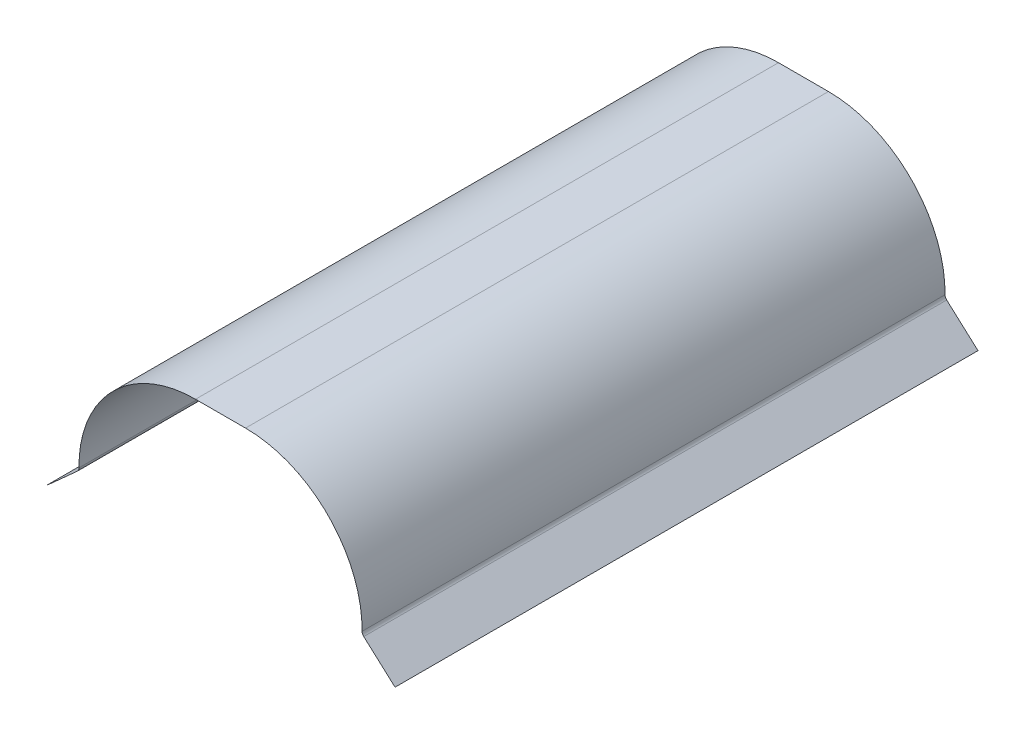
ISO-10303-21;
HEADER;
FILE_DESCRIPTION(('STEP AP214'),'2;1');
FILE_NAME('part.step','',(''),(''),'','','');
FILE_SCHEMA(('AUTOMOTIVE_DESIGN { 1 0 10303 214 1 1 1 1 }'));
ENDSEC;
DATA;
#1=APPLICATION_CONTEXT('core data for automotive mechanical design processes');
#2=APPLICATION_PROTOCOL_DEFINITION('international standard','automotive_design',2000,#1);
#3=PRODUCT_CONTEXT('',#1,'mechanical');
#4=PRODUCT('Part','Part','',(#3));
#5=PRODUCT_RELATED_PRODUCT_CATEGORY('part','',(#4));
#6=PRODUCT_DEFINITION_FORMATION('','',#4);
#7=PRODUCT_DEFINITION_CONTEXT('part definition',#1,'design');
#8=PRODUCT_DEFINITION('design','',#6,#7);
#9=PRODUCT_DEFINITION_SHAPE('','',#8);
#10=(LENGTH_UNIT() NAMED_UNIT(*) SI_UNIT(.MILLI.,.METRE.));
#11=(NAMED_UNIT(*) PLANE_ANGLE_UNIT() SI_UNIT($,.RADIAN.));
#12=(NAMED_UNIT(*) SI_UNIT($,.STERADIAN.) SOLID_ANGLE_UNIT());
#13=UNCERTAINTY_MEASURE_WITH_UNIT(LENGTH_MEASURE(1.E-05),#10,'distance_accuracy_value','');
#14=(GEOMETRIC_REPRESENTATION_CONTEXT(3) GLOBAL_UNCERTAINTY_ASSIGNED_CONTEXT((#13)) GLOBAL_UNIT_ASSIGNED_CONTEXT((#10,
#11,#12)) REPRESENTATION_CONTEXT('',''));
#15=CARTESIAN_POINT('',(0.,0.,0.));
#16=DIRECTION('',(0.,0.,1.));
#17=DIRECTION('',(1.,0.,0.));
#18=AXIS2_PLACEMENT_3D('',#15,#16,#17);
#19=CARTESIAN_POINT('',(15.,80.,350.));
#20=DIRECTION('',(0.,0.,1.));
#21=DIRECTION('',(1.,0.,0.));
#22=AXIS2_PLACEMENT_3D('',#19,#20,#21);
#23=PLANE('',#22);
#24=DIRECTION('',(0.,1.,0.));
#25=VECTOR('',#24,1.);
#26=CARTESIAN_POINT('',(15.,80.,350.));
#27=LINE('',#26,#25);
#28=CARTESIAN_POINT('',(15.,80.,350.));
#29=VERTEX_POINT('',#28);
#30=CARTESIAN_POINT('',(15.,80.001,350.));
#31=VERTEX_POINT('',#30);
#32=EDGE_CURVE('E11',#29,#31,#27,.T.);
#33=ORIENTED_EDGE('',*,*,#32,.F.);
#34=CARTESIAN_POINT('',(15.,9.99999999999998,350.));
#35=DIRECTION('',(0.,0.,1.));
#36=DIRECTION('',(1.,0.,0.));
#37=AXIS2_PLACEMENT_3D('',#34,#35,#36);
#38=CIRCLE('',#37,70.);
#39=CARTESIAN_POINT('',(84.9969029828859,9.3415375451356,350.));
#40=VERTEX_POINT('',#39);
#41=EDGE_CURVE('E303',#40,#29,#38,.T.);
#42=ORIENTED_EDGE('',*,*,#41,.F.);
#43=DIRECTION('',(0.999955756898279,-0.00940660650767222,0.));
#44=VECTOR('',#43,1.);
#45=CARTESIAN_POINT('',(84.9969029828859,9.3415375451356,350.));
#46=LINE('',#45,#44);
#47=CARTESIAN_POINT('',(84.9979029386428,9.34152813852909,350.));
#48=VERTEX_POINT('',#47);
#49=EDGE_CURVE('E289',#40,#48,#46,.T.);
#50=ORIENTED_EDGE('',*,*,#49,.T.);
#51=CARTESIAN_POINT('',(15.,9.99999999999998,350.));
#52=DIRECTION('',(0.,0.,1.));
#53=DIRECTION('',(1.,0.,0.));
#54=AXIS2_PLACEMENT_3D('',#51,#52,#53);
#55=CIRCLE('',#54,70.001);
#56=EDGE_CURVE('E179',#48,#31,#55,.T.);
#57=ORIENTED_EDGE('',*,*,#56,.T.);
#58=EDGE_LOOP('',(#33,#42,#50,#57));
#59=FACE_BOUND('',#58,.T.);
#60=ADVANCED_FACE('F37',(#59),#23,.T.);
#61=CARTESIAN_POINT('',(15.,80.001,0.));
#62=DIRECTION('',(0.,0.,-1.));
#63=DIRECTION('',(-1.,0.,0.));
#64=AXIS2_PLACEMENT_3D('',#61,#62,#63);
#65=PLANE('',#64);
#66=DIRECTION('',(0.,-1.,0.));
#67=VECTOR('',#66,1.);
#68=CARTESIAN_POINT('',(15.,80.001,0.));
#69=LINE('',#68,#67);
#70=CARTESIAN_POINT('',(15.,80.001,0.));
#71=VERTEX_POINT('',#70);
#72=CARTESIAN_POINT('',(15.,80.,0.));
#73=VERTEX_POINT('',#72);
#74=EDGE_CURVE('E45',#71,#73,#69,.T.);
#75=ORIENTED_EDGE('',*,*,#74,.F.);
#76=CARTESIAN_POINT('',(15.,9.99999999999998,0.));
#77=DIRECTION('',(0.,0.,1.));
#78=DIRECTION('',(1.,0.,0.));
#79=AXIS2_PLACEMENT_3D('',#76,#77,#78);
#80=CIRCLE('',#79,70.001);
#81=CARTESIAN_POINT('',(84.9979029386428,9.34152813852909,0.));
#82=VERTEX_POINT('',#81);
#83=EDGE_CURVE('E234',#82,#71,#80,.T.);
#84=ORIENTED_EDGE('',*,*,#83,.F.);
#85=DIRECTION('',(-0.999955756898279,0.00940660650767222,0.));
#86=VECTOR('',#85,1.);
#87=CARTESIAN_POINT('',(84.9979029386428,9.34152813852909,0.));
#88=LINE('',#87,#86);
#89=CARTESIAN_POINT('',(84.9969029828859,9.3415375451356,0.));
#90=VERTEX_POINT('',#89);
#91=EDGE_CURVE('E283',#82,#90,#88,.T.);
#92=ORIENTED_EDGE('',*,*,#91,.T.);
#93=CARTESIAN_POINT('',(15.,9.99999999999998,0.));
#94=DIRECTION('',(0.,0.,1.));
#95=DIRECTION('',(1.,0.,0.));
#96=AXIS2_PLACEMENT_3D('',#93,#94,#95);
#97=CIRCLE('',#96,70.);
#98=EDGE_CURVE('E216',#90,#73,#97,.T.);
#99=ORIENTED_EDGE('',*,*,#98,.T.);
#100=EDGE_LOOP('',(#75,#84,#92,#99));
#101=FACE_BOUND('',#100,.T.);
#102=ADVANCED_FACE('F307',(#101),#65,.T.);
#103=CARTESIAN_POINT('',(-15.,80.001,350.));
#104=DIRECTION('',(0.,0.,1.));
#105=DIRECTION('',(1.,0.,0.));
#106=AXIS2_PLACEMENT_3D('',#103,#104,#105);
#107=PLANE('',#106);
#108=DIRECTION('',(-3.46944695195014E-12,-1.,0.));
#109=VECTOR('',#108,1.);
#110=CARTESIAN_POINT('',(-15.,80.001,350.));
#111=LINE('',#110,#109);
#112=CARTESIAN_POINT('',(-15.,80.001,350.));
#113=VERTEX_POINT('',#112);
#114=CARTESIAN_POINT('',(-15.,80.,350.));
#115=VERTEX_POINT('',#114);
#116=EDGE_CURVE('E158',#113,#115,#111,.T.);
#117=ORIENTED_EDGE('',*,*,#116,.F.);
#118=CARTESIAN_POINT('',(-15.,9.99999999999998,350.));
#119=DIRECTION('',(0.,0.,1.));
#120=DIRECTION('',(1.,0.,0.));
#121=AXIS2_PLACEMENT_3D('',#118,#119,#120);
#122=CIRCLE('',#121,70.001);
#123=CARTESIAN_POINT('',(-84.9979029386428,9.34152813852909,350.));
#124=VERTEX_POINT('',#123);
#125=EDGE_CURVE('E162',#113,#124,#122,.T.);
#126=ORIENTED_EDGE('',*,*,#125,.T.);
#127=DIRECTION('',(0.999955756898362,0.00940660649886883,0.));
#128=VECTOR('',#127,1.);
#129=CARTESIAN_POINT('',(-84.9979029386428,9.34152813852909,350.));
#130=LINE('',#129,#128);
#131=CARTESIAN_POINT('',(-84.9969029828859,9.34153754513559,350.));
#132=VERTEX_POINT('',#131);
#133=EDGE_CURVE('E280',#124,#132,#130,.T.);
#134=ORIENTED_EDGE('',*,*,#133,.T.);
#135=CARTESIAN_POINT('',(-15.,9.99999999999998,350.));
#136=DIRECTION('',(0.,0.,1.));
#137=DIRECTION('',(1.,0.,0.));
#138=AXIS2_PLACEMENT_3D('',#135,#136,#137);
#139=CIRCLE('',#138,70.);
#140=EDGE_CURVE('E165',#115,#132,#139,.T.);
#141=ORIENTED_EDGE('',*,*,#140,.F.);
#142=EDGE_LOOP('',(#117,#126,#134,#141));
#143=FACE_BOUND('',#142,.T.);
#144=ADVANCED_FACE('F160',(#143),#107,.T.);
#145=CARTESIAN_POINT('',(-15.,80.,0.));
#146=DIRECTION('',(0.,0.,-1.));
#147=DIRECTION('',(-1.,0.,0.));
#148=AXIS2_PLACEMENT_3D('',#145,#146,#147);
#149=PLANE('',#148);
#150=DIRECTION('',(3.46944695195014E-12,1.,0.));
#151=VECTOR('',#150,1.);
#152=CARTESIAN_POINT('',(-15.,80.,0.));
#153=LINE('',#152,#151);
#154=CARTESIAN_POINT('',(-15.,80.,0.));
#155=VERTEX_POINT('',#154);
#156=CARTESIAN_POINT('',(-15.,80.001,0.));
#157=VERTEX_POINT('',#156);
#158=EDGE_CURVE('E170',#155,#157,#153,.T.);
#159=ORIENTED_EDGE('',*,*,#158,.F.);
#160=CARTESIAN_POINT('',(-15.,9.99999999999998,0.));
#161=DIRECTION('',(0.,0.,1.));
#162=DIRECTION('',(1.,0.,0.));
#163=AXIS2_PLACEMENT_3D('',#160,#161,#162);
#164=CIRCLE('',#163,70.);
#165=CARTESIAN_POINT('',(-84.9969029828859,9.34153754513559,0.));
#166=VERTEX_POINT('',#165);
#167=EDGE_CURVE('E211',#155,#166,#164,.T.);
#168=ORIENTED_EDGE('',*,*,#167,.T.);
#169=DIRECTION('',(-0.999955756898362,-0.00940660649886883,0.));
#170=VECTOR('',#169,1.);
#171=CARTESIAN_POINT('',(-84.9969029828859,9.34153754513559,0.));
#172=LINE('',#171,#170);
#173=CARTESIAN_POINT('',(-84.9979029386428,9.34152813852909,0.));
#174=VERTEX_POINT('',#173);
#175=EDGE_CURVE('E106',#166,#174,#172,.T.);
#176=ORIENTED_EDGE('',*,*,#175,.T.);
#177=CARTESIAN_POINT('',(-15.,9.99999999999998,0.));
#178=DIRECTION('',(0.,0.,1.));
#179=DIRECTION('',(1.,0.,0.));
#180=AXIS2_PLACEMENT_3D('',#177,#178,#179);
#181=CIRCLE('',#180,70.001);
#182=EDGE_CURVE('E238',#157,#174,#181,.T.);
#183=ORIENTED_EDGE('',*,*,#182,.F.);
#184=EDGE_LOOP('',(#159,#168,#176,#183));
#185=FACE_BOUND('',#184,.T.);
#186=ADVANCED_FACE('F378',(#185),#149,.T.);
#187=CARTESIAN_POINT('',(84.9969029828859,9.3415375451356,350.));
#188=DIRECTION('',(0.,0.,1.));
#189=DIRECTION('',(1.,0.,0.));
#190=AXIS2_PLACEMENT_3D('',#187,#188,#189);
#191=PLANE('',#190);
#192=ORIENTED_EDGE('',*,*,#49,.F.);
#193=CARTESIAN_POINT('',(87.9977702093379,9.31330831903492,350.));
#194=DIRECTION('',(0.,0.,1.));
#195=DIRECTION('',(1.,0.,0.));
#196=AXIS2_PLACEMENT_3D('',#193,#194,#195);
#197=CIRCLE('',#196,3.001);
#198=CARTESIAN_POINT('',(85.9897092596549,7.08313069777723,350.));
#199=VERTEX_POINT('',#198);
#200=EDGE_CURVE('E316',#199,#40,#197,.F.);
#201=ORIENTED_EDGE('',*,*,#200,.F.);
#202=DIRECTION('',(-0.669130606358676,-0.743144825477558,0.));
#203=VECTOR('',#202,1.);
#204=CARTESIAN_POINT('',(85.9903783902613,7.08387384260272,350.));
#205=LINE('',#204,#203);
#206=CARTESIAN_POINT('',(85.9903783902613,7.08387384260272,350.));
#207=VERTEX_POINT('',#206);
#208=EDGE_CURVE('E287',#207,#199,#205,.T.);
#209=ORIENTED_EDGE('',*,*,#208,.F.);
#210=CARTESIAN_POINT('',(87.9977702093379,9.31330831903492,350.));
#211=DIRECTION('',(0.,0.,1.));
#212=DIRECTION('',(1.,0.,0.));
#213=AXIS2_PLACEMENT_3D('',#210,#211,#212);
#214=CIRCLE('',#213,3.);
#215=EDGE_CURVE('E334',#207,#48,#214,.F.);
#216=ORIENTED_EDGE('',*,*,#215,.T.);
#217=EDGE_LOOP('',(#192,#201,#209,#216));
#218=FACE_BOUND('',#217,.T.);
#219=ADVANCED_FACE('F352',(#218),#191,.T.);
#220=CARTESIAN_POINT('',(85.9903783902613,7.08387384260272,350.));
#221=DIRECTION('',(0.,0.,1.));
#222=DIRECTION('',(1.,0.,0.));
#223=AXIS2_PLACEMENT_3D('',#220,#221,#222);
#224=PLANE('',#223);
#225=DIRECTION('',(-1.,0.,0.));
#226=VECTOR('',#225,1.);
#227=CARTESIAN_POINT('',(-15.,80.,350.));
#228=LINE('',#227,#226);
#229=EDGE_CURVE('E319',#29,#115,#228,.T.);
#230=ORIENTED_EDGE('',*,*,#229,.F.);
#231=ORIENTED_EDGE('',*,*,#32,.T.);
#232=DIRECTION('',(1.,0.,0.));
#233=VECTOR('',#232,1.);
#234=CARTESIAN_POINT('',(-15.,80.001,350.));
#235=LINE('',#234,#233);
#236=EDGE_CURVE('E173',#31,#113,#235,.F.);
#237=ORIENTED_EDGE('',*,*,#236,.T.);
#238=ORIENTED_EDGE('',*,*,#116,.T.);
#239=EDGE_LOOP('',(#230,#231,#237,#238));
#240=FACE_BOUND('',#239,.T.);
#241=ADVANCED_FACE('F175',(#240),#224,.T.);
#242=CARTESIAN_POINT('',(85.9897092596549,7.08313069777723,0.));
#243=DIRECTION('',(0.,0.,-1.));
#244=DIRECTION('',(-1.,0.,0.));
#245=AXIS2_PLACEMENT_3D('',#242,#243,#244);
#246=PLANE('',#245);
#247=DIRECTION('',(0.669130606358676,0.743144825477558,0.));
#248=VECTOR('',#247,1.);
#249=CARTESIAN_POINT('',(85.9897092596549,7.08313069777723,0.));
#250=LINE('',#249,#248);
#251=CARTESIAN_POINT('',(85.9897092596549,7.08313069777723,0.));
#252=VERTEX_POINT('',#251);
#253=CARTESIAN_POINT('',(85.9903783902613,7.08387384260272,0.));
#254=VERTEX_POINT('',#253);
#255=EDGE_CURVE('E285',#252,#254,#250,.T.);
#256=ORIENTED_EDGE('',*,*,#255,.F.);
#257=CARTESIAN_POINT('',(87.9977702093379,9.31330831903492,0.));
#258=DIRECTION('',(0.,0.,1.));
#259=DIRECTION('',(1.,0.,0.));
#260=AXIS2_PLACEMENT_3D('',#257,#258,#259);
#261=CIRCLE('',#260,3.001);
#262=EDGE_CURVE('E219',#252,#90,#261,.F.);
#263=ORIENTED_EDGE('',*,*,#262,.T.);
#264=ORIENTED_EDGE('',*,*,#91,.F.);
#265=CARTESIAN_POINT('',(87.9977702093379,9.31330831903492,0.));
#266=DIRECTION('',(0.,0.,1.));
#267=DIRECTION('',(1.,0.,0.));
#268=AXIS2_PLACEMENT_3D('',#265,#266,#267);
#269=CIRCLE('',#268,3.);
#270=EDGE_CURVE('E231',#254,#82,#269,.F.);
#271=ORIENTED_EDGE('',*,*,#270,.F.);
#272=EDGE_LOOP('',(#256,#263,#264,#271));
#273=FACE_BOUND('',#272,.T.);
#274=ADVANCED_FACE('F344',(#273),#246,.T.);
#275=CARTESIAN_POINT('',(84.9979029386428,9.34152813852909,0.));
#276=DIRECTION('',(0.,0.,-1.));
#277=DIRECTION('',(-1.,0.,0.));
#278=AXIS2_PLACEMENT_3D('',#275,#276,#277);
#279=PLANE('',#278);
#280=DIRECTION('',(-0.743144825477402,0.66913060635885,0.));
#281=VECTOR('',#280,1.);
#282=CARTESIAN_POINT('',(84.9714227381436,8.,0.));
#283=LINE('',#282,#281);
#284=CARTESIAN_POINT('',(104.783663785371,-9.83902196552694,0.));
#285=VERTEX_POINT('',#284);
#286=EDGE_CURVE('E222',#285,#252,#283,.T.);
#287=ORIENTED_EDGE('',*,*,#286,.T.);
#288=ORIENTED_EDGE('',*,*,#255,.T.);
#289=DIRECTION('',(-0.743144825477402,0.66913060635885,0.));
#290=VECTOR('',#289,1.);
#291=CARTESIAN_POINT('',(84.97209186875,8.00074314482548,0.));
#292=LINE('',#291,#290);
#293=CARTESIAN_POINT('',(104.784332915978,-9.83827882070146,0.));
#294=VERTEX_POINT('',#293);
#295=EDGE_CURVE('E228',#294,#254,#292,.T.);
#296=ORIENTED_EDGE('',*,*,#295,.F.);
#297=DIRECTION('',(-0.669130606356188,-0.743144825479799,0.));
#298=VECTOR('',#297,1.);
#299=CARTESIAN_POINT('',(104.784332915978,-9.83827882070146,0.));
#300=LINE('',#299,#298);
#301=EDGE_CURVE('E225',#294,#285,#300,.T.);
#302=ORIENTED_EDGE('',*,*,#301,.T.);
#303=EDGE_LOOP('',(#287,#288,#296,#302));
#304=FACE_BOUND('',#303,.T.);
#305=ADVANCED_FACE('F360',(#304),#279,.T.);
#306=CARTESIAN_POINT('',(-85.9897092596549,7.08313069777722,350.));
#307=DIRECTION('',(0.,0.,1.));
#308=DIRECTION('',(1.,0.,0.));
#309=AXIS2_PLACEMENT_3D('',#306,#307,#308);
#310=PLANE('',#309);
#311=DIRECTION('',(-0.66913060635705,0.743144825479022,0.));
#312=VECTOR('',#311,1.);
#313=CARTESIAN_POINT('',(-85.9897092596549,7.08313069777722,350.));
#314=LINE('',#313,#312);
#315=CARTESIAN_POINT('',(-85.9897092596549,7.08313069777722,350.));
#316=VERTEX_POINT('',#315);
#317=CARTESIAN_POINT('',(-85.9903783902613,7.0838738426027,350.));
#318=VERTEX_POINT('',#317);
#319=EDGE_CURVE('E53',#316,#318,#314,.T.);
#320=ORIENTED_EDGE('',*,*,#319,.F.);
#321=CARTESIAN_POINT('',(-87.9977702093379,9.3133083190349,350.));
#322=DIRECTION('',(0.,0.,1.));
#323=DIRECTION('',(1.,0.,0.));
#324=AXIS2_PLACEMENT_3D('',#321,#322,#323);
#325=CIRCLE('',#324,3.001);
#326=EDGE_CURVE('E690',#132,#316,#325,.F.);
#327=ORIENTED_EDGE('',*,*,#326,.F.);
#328=ORIENTED_EDGE('',*,*,#133,.F.);
#329=CARTESIAN_POINT('',(-87.9977702093379,9.3133083190349,350.));
#330=DIRECTION('',(0.,0.,1.));
#331=DIRECTION('',(1.,0.,0.));
#332=AXIS2_PLACEMENT_3D('',#329,#330,#331);
#333=CIRCLE('',#332,3.);
#334=EDGE_CURVE('E194',#124,#318,#333,.F.);
#335=ORIENTED_EDGE('',*,*,#334,.T.);
#336=EDGE_LOOP('',(#320,#327,#328,#335));
#337=FACE_BOUND('',#336,.T.);
#338=ADVANCED_FACE('F391',(#337),#310,.T.);
#339=CARTESIAN_POINT('',(-84.9979029386428,9.34152813852909,350.));
#340=DIRECTION('',(0.,0.,1.));
#341=DIRECTION('',(1.,0.,0.));
#342=AXIS2_PLACEMENT_3D('',#339,#340,#341);
#343=PLANE('',#342);
#344=DIRECTION('',(-0.743144825477398,-0.669130606358854,0.));
#345=VECTOR('',#344,1.);
#346=CARTESIAN_POINT('',(-84.9714227381436,8.,350.));
#347=LINE('',#346,#345);
#348=CARTESIAN_POINT('',(-104.783663785371,-9.83902196552706,350.));
#349=VERTEX_POINT('',#348);
#350=EDGE_CURVE('E692',#316,#349,#347,.T.);
#351=ORIENTED_EDGE('',*,*,#350,.F.);
#352=ORIENTED_EDGE('',*,*,#319,.T.);
#353=DIRECTION('',(-0.743144825477398,-0.669130606358855,0.));
#354=VECTOR('',#353,1.);
#355=CARTESIAN_POINT('',(-84.97209186875,8.00074314482548,350.));
#356=LINE('',#355,#354);
#357=CARTESIAN_POINT('',(-104.784332915977,-9.83827882070159,350.));
#358=VERTEX_POINT('',#357);
#359=EDGE_CURVE('E119',#318,#358,#356,.T.);
#360=ORIENTED_EDGE('',*,*,#359,.T.);
#361=DIRECTION('',(-0.669130606359638,0.743144825476692,0.));
#362=VECTOR('',#361,1.);
#363=CARTESIAN_POINT('',(-104.783663785371,-9.83902196552706,350.));
#364=LINE('',#363,#362);
#365=EDGE_CURVE('E693',#349,#358,#364,.T.);
#366=ORIENTED_EDGE('',*,*,#365,.F.);
#367=EDGE_LOOP('',(#351,#352,#360,#366));
#368=FACE_BOUND('',#367,.T.);
#369=ADVANCED_FACE('F394',(#368),#343,.T.);
#370=CARTESIAN_POINT('',(-84.9969029828859,9.34153754513559,0.));
#371=DIRECTION('',(0.,0.,-1.));
#372=DIRECTION('',(-1.,0.,0.));
#373=AXIS2_PLACEMENT_3D('',#370,#371,#372);
#374=PLANE('',#373);
#375=ORIENTED_EDGE('',*,*,#175,.F.);
#376=CARTESIAN_POINT('',(-87.9977702093379,9.3133083190349,0.));
#377=DIRECTION('',(0.,0.,1.));
#378=DIRECTION('',(1.,0.,0.));
#379=AXIS2_PLACEMENT_3D('',#376,#377,#378);
#380=CIRCLE('',#379,3.001);
#381=CARTESIAN_POINT('',(-85.9897092596549,7.08313069777722,0.));
#382=VERTEX_POINT('',#381);
#383=EDGE_CURVE('E209',#166,#382,#380,.F.);
#384=ORIENTED_EDGE('',*,*,#383,.T.);
#385=DIRECTION('',(0.66913060635705,-0.743144825479022,0.));
#386=VECTOR('',#385,1.);
#387=CARTESIAN_POINT('',(-85.9903783902613,7.0838738426027,0.));
#388=LINE('',#387,#386);
#389=CARTESIAN_POINT('',(-85.9903783902613,7.0838738426027,0.));
#390=VERTEX_POINT('',#389);
#391=EDGE_CURVE('E113',#390,#382,#388,.T.);
#392=ORIENTED_EDGE('',*,*,#391,.F.);
#393=CARTESIAN_POINT('',(-87.9977702093379,9.3133083190349,0.));
#394=DIRECTION('',(0.,0.,1.));
#395=DIRECTION('',(1.,0.,0.));
#396=AXIS2_PLACEMENT_3D('',#393,#394,#395);
#397=CIRCLE('',#396,3.);
#398=EDGE_CURVE('E240',#174,#390,#397,.F.);
#399=ORIENTED_EDGE('',*,*,#398,.F.);
#400=EDGE_LOOP('',(#375,#384,#392,#399));
#401=FACE_BOUND('',#400,.T.);
#402=ADVANCED_FACE('F398',(#401),#374,.T.);
#403=CARTESIAN_POINT('',(-85.9903783902613,7.0838738426027,0.));
#404=DIRECTION('',(0.,0.,-1.));
#405=DIRECTION('',(-1.,0.,0.));
#406=AXIS2_PLACEMENT_3D('',#403,#404,#405);
#407=PLANE('',#406);
#408=DIRECTION('',(-1.,0.,0.));
#409=VECTOR('',#408,1.);
#410=CARTESIAN_POINT('',(-15.,80.,0.));
#411=LINE('',#410,#409);
#412=EDGE_CURVE('E213',#73,#155,#411,.T.);
#413=ORIENTED_EDGE('',*,*,#412,.T.);
#414=ORIENTED_EDGE('',*,*,#158,.T.);
#415=DIRECTION('',(1.,0.,0.));
#416=VECTOR('',#415,1.);
#417=CARTESIAN_POINT('',(-15.,80.001,0.));
#418=LINE('',#417,#416);
#419=EDGE_CURVE('E186',#71,#157,#418,.F.);
#420=ORIENTED_EDGE('',*,*,#419,.F.);
#421=ORIENTED_EDGE('',*,*,#74,.T.);
#422=EDGE_LOOP('',(#413,#414,#420,#421));
#423=FACE_BOUND('',#422,.T.);
#424=ADVANCED_FACE('F292',(#423),#407,.T.);
#425=CARTESIAN_POINT('',(-84.97209186875,8.00074314482548,350.));
#426=DIRECTION('',(0.669130606358855,-0.743144825477398,0.));
#427=DIRECTION('',(0.743144825477398,0.669130606358855,0.));
#428=AXIS2_PLACEMENT_3D('',#425,#426,#427);
#429=PLANE('',#428);
#430=DIRECTION('',(-0.743144825477398,-0.669130606358855,0.));
#431=VECTOR('',#430,1.);
#432=CARTESIAN_POINT('',(-84.97209186875,8.00074314482548,0.));
#433=LINE('',#432,#431);
#434=CARTESIAN_POINT('',(-104.784332915977,-9.83827882070159,0.));
#435=VERTEX_POINT('',#434);
#436=EDGE_CURVE('E200',#390,#435,#433,.T.);
#437=ORIENTED_EDGE('',*,*,#436,.T.);
#438=DIRECTION('',(0.,0.,-1.));
#439=VECTOR('',#438,1.);
#440=CARTESIAN_POINT('',(-104.784332915977,-9.83827882070159,350.));
#441=LINE('',#440,#439);
#442=EDGE_CURVE('E276',#358,#435,#441,.T.);
#443=ORIENTED_EDGE('',*,*,#442,.F.);
#444=ORIENTED_EDGE('',*,*,#359,.F.);
#445=DIRECTION('',(0.,0.,-1.));
#446=VECTOR('',#445,1.);
#447=CARTESIAN_POINT('',(-85.9903783902613,7.0838738426027,350.));
#448=LINE('',#447,#446);
#449=EDGE_CURVE('E196',#318,#390,#448,.T.);
#450=ORIENTED_EDGE('',*,*,#449,.T.);
#451=EDGE_LOOP('',(#437,#443,#444,#450));
#452=FACE_BOUND('',#451,.T.);
#453=ADVANCED_FACE('F403',(#452),#429,.F.);
#454=CARTESIAN_POINT('',(-104.783663785371,-9.83902196552706,350.));
#455=DIRECTION('',(-0.743144825476692,-0.669130606359638,0.));
#456=DIRECTION('',(0.669130606359638,-0.743144825476692,0.));
#457=AXIS2_PLACEMENT_3D('',#454,#455,#456);
#458=PLANE('',#457);
#459=DIRECTION('',(-0.669130606359638,0.743144825476692,0.));
#460=VECTOR('',#459,1.);
#461=CARTESIAN_POINT('',(-104.783663785371,-9.83902196552706,0.));
#462=LINE('',#461,#460);
#463=CARTESIAN_POINT('',(-104.783663785371,-9.83902196552706,0.));
#464=VERTEX_POINT('',#463);
#465=EDGE_CURVE('E203',#464,#435,#462,.T.);
#466=ORIENTED_EDGE('',*,*,#465,.F.);
#467=DIRECTION('',(0.,0.,-1.));
#468=VECTOR('',#467,1.);
#469=CARTESIAN_POINT('',(-104.783663785371,-9.83902196552706,350.));
#470=LINE('',#469,#468);
#471=EDGE_CURVE('E274',#349,#464,#470,.T.);
#472=ORIENTED_EDGE('',*,*,#471,.F.);
#473=ORIENTED_EDGE('',*,*,#365,.T.);
#474=ORIENTED_EDGE('',*,*,#442,.T.);
#475=EDGE_LOOP('',(#466,#472,#473,#474));
#476=FACE_BOUND('',#475,.T.);
#477=ADVANCED_FACE('F406',(#476),#458,.T.);
#478=CARTESIAN_POINT('',(-84.9714227381436,8.,350.));
#479=DIRECTION('',(0.669130606358854,-0.743144825477398,0.));
#480=DIRECTION('',(0.743144825477398,0.669130606358855,0.));
#481=AXIS2_PLACEMENT_3D('',#478,#479,#480);
#482=PLANE('',#481);
#483=DIRECTION('',(-0.743144825477398,-0.669130606358854,0.));
#484=VECTOR('',#483,1.);
#485=CARTESIAN_POINT('',(-84.9714227381436,8.,0.));
#486=LINE('',#485,#484);
#487=EDGE_CURVE('E206',#382,#464,#486,.T.);
#488=ORIENTED_EDGE('',*,*,#487,.F.);
#489=DIRECTION('',(0.,0.,-1.));
#490=VECTOR('',#489,1.);
#491=CARTESIAN_POINT('',(-85.9897092596549,7.08313069777722,350.));
#492=LINE('',#491,#490);
#493=EDGE_CURVE('E271',#316,#382,#492,.T.);
#494=ORIENTED_EDGE('',*,*,#493,.F.);
#495=ORIENTED_EDGE('',*,*,#350,.T.);
#496=ORIENTED_EDGE('',*,*,#471,.T.);
#497=EDGE_LOOP('',(#488,#494,#495,#496));
#498=FACE_BOUND('',#497,.T.);
#499=ADVANCED_FACE('F410',(#498),#482,.T.);
#500=CARTESIAN_POINT('',(-87.9977702093379,9.3133083190349,350.));
#501=DIRECTION('',(0.,0.,-1.));
#502=DIRECTION('',(-1.,0.,0.));
#503=AXIS2_PLACEMENT_3D('',#500,#501,#502);
#504=CYLINDRICAL_SURFACE('',#503,3.001);
#505=ORIENTED_EDGE('',*,*,#383,.F.);
#506=DIRECTION('',(0.,0.,-1.));
#507=VECTOR('',#506,1.);
#508=CARTESIAN_POINT('',(-84.9969029828859,9.34153754513559,350.));
#509=LINE('',#508,#507);
#510=EDGE_CURVE('E268',#132,#166,#509,.T.);
#511=ORIENTED_EDGE('',*,*,#510,.F.);
#512=ORIENTED_EDGE('',*,*,#326,.T.);
#513=ORIENTED_EDGE('',*,*,#493,.T.);
#514=EDGE_LOOP('',(#505,#511,#512,#513));
#515=FACE_BOUND('',#514,.T.);
#516=ADVANCED_FACE('F414',(#515),#504,.T.);
#517=CARTESIAN_POINT('',(-15.,9.99999999999998,350.));
#518=DIRECTION('',(0.,0.,-1.));
#519=DIRECTION('',(-1.,0.,0.));
#520=AXIS2_PLACEMENT_3D('',#517,#518,#519);
#521=CYLINDRICAL_SURFACE('',#520,70.);
#522=ORIENTED_EDGE('',*,*,#167,.F.);
#523=DIRECTION('',(0.,0.,-1.));
#524=VECTOR('',#523,1.);
#525=CARTESIAN_POINT('',(-15.,80.,350.));
#526=LINE('',#525,#524);
#527=EDGE_CURVE('E265',#115,#155,#526,.T.);
#528=ORIENTED_EDGE('',*,*,#527,.F.);
#529=ORIENTED_EDGE('',*,*,#140,.T.);
#530=ORIENTED_EDGE('',*,*,#510,.T.);
#531=EDGE_LOOP('',(#522,#528,#529,#530));
#532=FACE_BOUND('',#531,.T.);
#533=ADVANCED_FACE('F418',(#532),#521,.F.);
#534=CARTESIAN_POINT('',(-15.,80.,350.));
#535=DIRECTION('',(0.,-1.,0.));
#536=DIRECTION('',(0.,0.,-1.));
#537=AXIS2_PLACEMENT_3D('',#534,#535,#536);
#538=PLANE('',#537);
#539=ORIENTED_EDGE('',*,*,#412,.F.);
#540=DIRECTION('',(0.,0.,-1.));
#541=VECTOR('',#540,1.);
#542=CARTESIAN_POINT('',(15.,80.,350.));
#543=LINE('',#542,#541);
#544=EDGE_CURVE('E262',#29,#73,#543,.T.);
#545=ORIENTED_EDGE('',*,*,#544,.F.);
#546=ORIENTED_EDGE('',*,*,#229,.T.);
#547=ORIENTED_EDGE('',*,*,#527,.T.);
#548=EDGE_LOOP('',(#539,#545,#546,#547));
#549=FACE_BOUND('',#548,.T.);
#550=ADVANCED_FACE('F305',(#549),#538,.T.);
#551=CARTESIAN_POINT('',(15.,9.99999999999998,350.));
#552=DIRECTION('',(0.,0.,-1.));
#553=DIRECTION('',(-1.,0.,0.));
#554=AXIS2_PLACEMENT_3D('',#551,#552,#553);
#555=CYLINDRICAL_SURFACE('',#554,70.);
#556=ORIENTED_EDGE('',*,*,#98,.F.);
#557=DIRECTION('',(0.,0.,-1.));
#558=VECTOR('',#557,1.);
#559=CARTESIAN_POINT('',(84.9969029828859,9.3415375451356,350.));
#560=LINE('',#559,#558);
#561=EDGE_CURVE('E259',#40,#90,#560,.T.);
#562=ORIENTED_EDGE('',*,*,#561,.F.);
#563=ORIENTED_EDGE('',*,*,#41,.T.);
#564=ORIENTED_EDGE('',*,*,#544,.T.);
#565=EDGE_LOOP('',(#556,#562,#563,#564));
#566=FACE_BOUND('',#565,.T.);
#567=ADVANCED_FACE('F300',(#566),#555,.F.);
#568=CARTESIAN_POINT('',(87.9977702093379,9.31330831903492,350.));
#569=DIRECTION('',(0.,0.,-1.));
#570=DIRECTION('',(-1.,0.,0.));
#571=AXIS2_PLACEMENT_3D('',#568,#569,#570);
#572=CYLINDRICAL_SURFACE('',#571,3.001);
#573=ORIENTED_EDGE('',*,*,#262,.F.);
#574=DIRECTION('',(0.,0.,-1.));
#575=VECTOR('',#574,1.);
#576=CARTESIAN_POINT('',(85.9897092596549,7.08313069777723,350.));
#577=LINE('',#576,#575);
#578=EDGE_CURVE('E256',#199,#252,#577,.T.);
#579=ORIENTED_EDGE('',*,*,#578,.F.);
#580=ORIENTED_EDGE('',*,*,#200,.T.);
#581=ORIENTED_EDGE('',*,*,#561,.T.);
#582=EDGE_LOOP('',(#573,#579,#580,#581));
#583=FACE_BOUND('',#582,.T.);
#584=ADVANCED_FACE('F313',(#583),#572,.T.);
#585=CARTESIAN_POINT('',(84.9714227381436,8.,350.));
#586=DIRECTION('',(-0.66913060635885,-0.743144825477402,0.));
#587=DIRECTION('',(0.743144825477402,-0.66913060635885,0.));
#588=AXIS2_PLACEMENT_3D('',#585,#586,#587);
#589=PLANE('',#588);
#590=ORIENTED_EDGE('',*,*,#286,.F.);
#591=DIRECTION('',(0.,0.,-1.));
#592=VECTOR('',#591,1.);
#593=CARTESIAN_POINT('',(104.783663785371,-9.83902196552694,350.));
#594=LINE('',#593,#592);
#595=CARTESIAN_POINT('',(104.783663785371,-9.83902196552694,350.));
#596=VERTEX_POINT('',#595);
#597=EDGE_CURVE('E254',#596,#285,#594,.T.);
#598=ORIENTED_EDGE('',*,*,#597,.F.);
#599=DIRECTION('',(-0.743144825477402,0.66913060635885,0.));
#600=VECTOR('',#599,1.);
#601=CARTESIAN_POINT('',(84.9714227381436,8.,350.));
#602=LINE('',#601,#600);
#603=EDGE_CURVE('E321',#596,#199,#602,.T.);
#604=ORIENTED_EDGE('',*,*,#603,.T.);
#605=ORIENTED_EDGE('',*,*,#578,.T.);
#606=EDGE_LOOP('',(#590,#598,#604,#605));
#607=FACE_BOUND('',#606,.T.);
#608=ADVANCED_FACE('F349',(#607),#589,.T.);
#609=CARTESIAN_POINT('',(104.784332915978,-9.83827882070146,350.));
#610=DIRECTION('',(0.743144825479799,-0.669130606356187,0.));
#611=DIRECTION('',(0.669130606356188,0.743144825479799,0.));
#612=AXIS2_PLACEMENT_3D('',#609,#610,#611);
#613=PLANE('',#612);
#614=ORIENTED_EDGE('',*,*,#301,.F.);
#615=DIRECTION('',(0.,0.,-1.));
#616=VECTOR('',#615,1.);
#617=CARTESIAN_POINT('',(104.784332915978,-9.83827882070146,350.));
#618=LINE('',#617,#616);
#619=CARTESIAN_POINT('',(104.784332915978,-9.83827882070146,350.));
#620=VERTEX_POINT('',#619);
#621=EDGE_CURVE('E252',#620,#294,#618,.T.);
#622=ORIENTED_EDGE('',*,*,#621,.F.);
#623=DIRECTION('',(-0.669130606356188,-0.743144825479799,0.));
#624=VECTOR('',#623,1.);
#625=CARTESIAN_POINT('',(104.784332915978,-9.83827882070146,350.));
#626=LINE('',#625,#624);
#627=EDGE_CURVE('E328',#620,#596,#626,.T.);
#628=ORIENTED_EDGE('',*,*,#627,.T.);
#629=ORIENTED_EDGE('',*,*,#597,.T.);
#630=EDGE_LOOP('',(#614,#622,#628,#629));
#631=FACE_BOUND('',#630,.T.);
#632=ADVANCED_FACE('F362',(#631),#613,.T.);
#633=CARTESIAN_POINT('',(84.97209186875,8.00074314482548,350.));
#634=DIRECTION('',(-0.66913060635885,-0.743144825477402,0.));
#635=DIRECTION('',(0.743144825477402,-0.66913060635885,0.));
#636=AXIS2_PLACEMENT_3D('',#633,#634,#635);
#637=PLANE('',#636);
#638=ORIENTED_EDGE('',*,*,#295,.T.);
#639=DIRECTION('',(0.,0.,-1.));
#640=VECTOR('',#639,1.);
#641=CARTESIAN_POINT('',(85.9903783902613,7.08387384260272,350.));
#642=LINE('',#641,#640);
#643=EDGE_CURVE('E249',#207,#254,#642,.T.);
#644=ORIENTED_EDGE('',*,*,#643,.F.);
#645=DIRECTION('',(-0.743144825477402,0.66913060635885,0.));
#646=VECTOR('',#645,1.);
#647=CARTESIAN_POINT('',(84.97209186875,8.00074314482548,350.));
#648=LINE('',#647,#646);
#649=EDGE_CURVE('E331',#620,#207,#648,.T.);
#650=ORIENTED_EDGE('',*,*,#649,.F.);
#651=ORIENTED_EDGE('',*,*,#621,.T.);
#652=EDGE_LOOP('',(#638,#644,#650,#651));
#653=FACE_BOUND('',#652,.T.);
#654=ADVANCED_FACE('F358',(#653),#637,.F.);
#655=CARTESIAN_POINT('',(87.9977702093379,9.31330831903492,350.));
#656=DIRECTION('',(0.,0.,-1.));
#657=DIRECTION('',(-1.,0.,0.));
#658=AXIS2_PLACEMENT_3D('',#655,#656,#657);
#659=CYLINDRICAL_SURFACE('',#658,3.);
#660=ORIENTED_EDGE('',*,*,#270,.T.);
#661=DIRECTION('',(0.,0.,-1.));
#662=VECTOR('',#661,1.);
#663=CARTESIAN_POINT('',(84.9979029386428,9.34152813852909,350.));
#664=LINE('',#663,#662);
#665=EDGE_CURVE('E246',#48,#82,#664,.T.);
#666=ORIENTED_EDGE('',*,*,#665,.F.);
#667=ORIENTED_EDGE('',*,*,#215,.F.);
#668=ORIENTED_EDGE('',*,*,#643,.T.);
#669=EDGE_LOOP('',(#660,#666,#667,#668));
#670=FACE_BOUND('',#669,.T.);
#671=ADVANCED_FACE('F342',(#670),#659,.F.);
#672=CARTESIAN_POINT('',(15.,9.99999999999998,350.));
#673=DIRECTION('',(0.,0.,-1.));
#674=DIRECTION('',(-1.,0.,0.));
#675=AXIS2_PLACEMENT_3D('',#672,#673,#674);
#676=CYLINDRICAL_SURFACE('',#675,70.001);
#677=ORIENTED_EDGE('',*,*,#83,.T.);
#678=DIRECTION('',(0.,0.,-1.));
#679=VECTOR('',#678,1.);
#680=CARTESIAN_POINT('',(15.,80.001,350.));
#681=LINE('',#680,#679);
#682=EDGE_CURVE('E188',#31,#71,#681,.T.);
#683=ORIENTED_EDGE('',*,*,#682,.F.);
#684=ORIENTED_EDGE('',*,*,#56,.F.);
#685=ORIENTED_EDGE('',*,*,#665,.T.);
#686=EDGE_LOOP('',(#677,#683,#684,#685));
#687=FACE_BOUND('',#686,.T.);
#688=ADVANCED_FACE('F338',(#687),#676,.T.);
#689=CARTESIAN_POINT('',(-15.,80.001,350.));
#690=DIRECTION('',(0.,-1.,0.));
#691=DIRECTION('',(0.,0.,-1.));
#692=AXIS2_PLACEMENT_3D('',#689,#690,#691);
#693=PLANE('',#692);
#694=ORIENTED_EDGE('',*,*,#419,.T.);
#695=DIRECTION('',(0.,0.,-1.));
#696=VECTOR('',#695,1.);
#697=CARTESIAN_POINT('',(-15.,80.001,350.));
#698=LINE('',#697,#696);
#699=EDGE_CURVE('E183',#113,#157,#698,.T.);
#700=ORIENTED_EDGE('',*,*,#699,.F.);
#701=ORIENTED_EDGE('',*,*,#236,.F.);
#702=ORIENTED_EDGE('',*,*,#682,.T.);
#703=EDGE_LOOP('',(#694,#700,#701,#702));
#704=FACE_BOUND('',#703,.T.);
#705=ADVANCED_FACE('F184',(#704),#693,.F.);
#706=CARTESIAN_POINT('',(-15.,9.99999999999998,350.));
#707=DIRECTION('',(0.,0.,-1.));
#708=DIRECTION('',(-1.,0.,0.));
#709=AXIS2_PLACEMENT_3D('',#706,#707,#708);
#710=CYLINDRICAL_SURFACE('',#709,70.001);
#711=ORIENTED_EDGE('',*,*,#182,.T.);
#712=DIRECTION('',(0.,0.,-1.));
#713=VECTOR('',#712,1.);
#714=CARTESIAN_POINT('',(-84.9979029386428,9.34152813852909,350.));
#715=LINE('',#714,#713);
#716=EDGE_CURVE('E189',#124,#174,#715,.T.);
#717=ORIENTED_EDGE('',*,*,#716,.F.);
#718=ORIENTED_EDGE('',*,*,#125,.F.);
#719=ORIENTED_EDGE('',*,*,#699,.T.);
#720=EDGE_LOOP('',(#711,#717,#718,#719));
#721=FACE_BOUND('',#720,.T.);
#722=ADVANCED_FACE('F191',(#721),#710,.T.);
#723=CARTESIAN_POINT('',(-87.9977702093379,9.3133083190349,350.));
#724=DIRECTION('',(0.,0.,-1.));
#725=DIRECTION('',(-1.,0.,0.));
#726=AXIS2_PLACEMENT_3D('',#723,#724,#725);
#727=CYLINDRICAL_SURFACE('',#726,3.);
#728=ORIENTED_EDGE('',*,*,#398,.T.);
#729=ORIENTED_EDGE('',*,*,#449,.F.);
#730=ORIENTED_EDGE('',*,*,#334,.F.);
#731=ORIENTED_EDGE('',*,*,#716,.T.);
#732=EDGE_LOOP('',(#728,#729,#730,#731));
#733=FACE_BOUND('',#732,.T.);
#734=ADVANCED_FACE('F485',(#733),#727,.F.);
#735=CARTESIAN_POINT('',(-87.9977702093379,9.3133083190349,350.));
#736=DIRECTION('',(0.,0.,1.));
#737=DIRECTION('',(1.,0.,0.));
#738=AXIS2_PLACEMENT_3D('',#735,#736,#737);
#739=PLANE('',#738);
#740=ORIENTED_EDGE('',*,*,#649,.T.);
#741=ORIENTED_EDGE('',*,*,#208,.T.);
#742=ORIENTED_EDGE('',*,*,#603,.F.);
#743=ORIENTED_EDGE('',*,*,#627,.F.);
#744=EDGE_LOOP('',(#740,#741,#742,#743));
#745=FACE_BOUND('',#744,.T.);
#746=ADVANCED_FACE('F356',(#745),#739,.T.);
#747=CARTESIAN_POINT('',(-87.9977702093379,9.3133083190349,0.));
#748=DIRECTION('',(0.,0.,1.));
#749=DIRECTION('',(1.,0.,0.));
#750=AXIS2_PLACEMENT_3D('',#747,#748,#749);
#751=PLANE('',#750);
#752=ORIENTED_EDGE('',*,*,#436,.F.);
#753=ORIENTED_EDGE('',*,*,#391,.T.);
#754=ORIENTED_EDGE('',*,*,#487,.T.);
#755=ORIENTED_EDGE('',*,*,#465,.T.);
#756=EDGE_LOOP('',(#752,#753,#754,#755));
#757=FACE_BOUND('',#756,.T.);
#758=ADVANCED_FACE('F505',(#757),#751,.F.);
#759=CLOSED_SHELL('',(#60,#102,#144,#186,#219,#241,#274,#305,#338,#369,#402,#424,#453,#477,#499,
#516,#533,#550,#567,#584,#608,#632,#654,#671,#688,#705,#722,#734,#746,#758));
#760=MANIFOLD_SOLID_BREP('B2',#759);
#761=ADVANCED_BREP_SHAPE_REPRESENTATION('',(#18,#760),#14);
#762=SHAPE_DEFINITION_REPRESENTATION(#9,#761);
ENDSEC;
END-ISO-10303-21;
